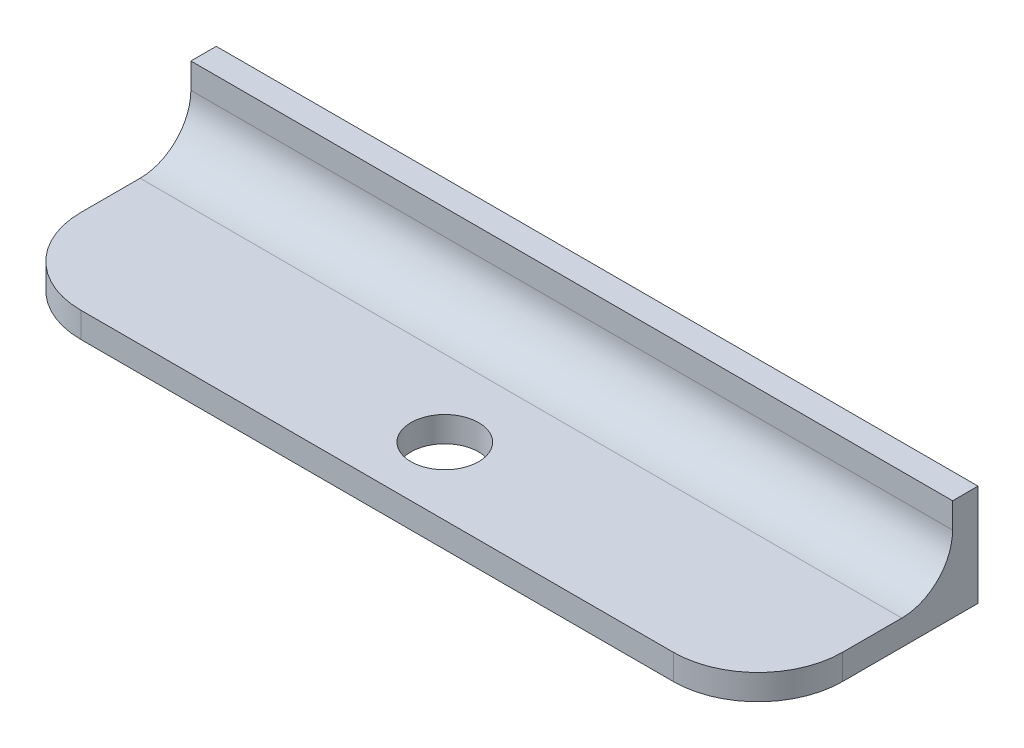
ISO-10303-21;
HEADER;
FILE_DESCRIPTION(('STEP AP214'),'2;1');
FILE_NAME('part.step','',(''),(''),'','','');
FILE_SCHEMA(('AUTOMOTIVE_DESIGN { 1 0 10303 214 1 1 1 1 }'));
ENDSEC;
DATA;
#1=APPLICATION_CONTEXT('core data for automotive mechanical design processes');
#2=APPLICATION_PROTOCOL_DEFINITION('international standard','automotive_design',2000,#1);
#3=PRODUCT_CONTEXT('',#1,'mechanical');
#4=PRODUCT('Part','Part','',(#3));
#5=PRODUCT_RELATED_PRODUCT_CATEGORY('part','',(#4));
#6=PRODUCT_DEFINITION_FORMATION('','',#4);
#7=PRODUCT_DEFINITION_CONTEXT('part definition',#1,'design');
#8=PRODUCT_DEFINITION('design','',#6,#7);
#9=PRODUCT_DEFINITION_SHAPE('','',#8);
#10=(LENGTH_UNIT() NAMED_UNIT(*) SI_UNIT(.MILLI.,.METRE.));
#11=(NAMED_UNIT(*) PLANE_ANGLE_UNIT() SI_UNIT($,.RADIAN.));
#12=(NAMED_UNIT(*) SI_UNIT($,.STERADIAN.) SOLID_ANGLE_UNIT());
#13=UNCERTAINTY_MEASURE_WITH_UNIT(LENGTH_MEASURE(1.E-05),#10,'distance_accuracy_value','');
#14=(GEOMETRIC_REPRESENTATION_CONTEXT(3) GLOBAL_UNCERTAINTY_ASSIGNED_CONTEXT((#13)) GLOBAL_UNIT_ASSIGNED_CONTEXT((#10,
#11,#12)) REPRESENTATION_CONTEXT('',''));
#15=CARTESIAN_POINT('',(0.,0.,0.));
#16=DIRECTION('',(0.,0.,1.));
#17=DIRECTION('',(1.,0.,0.));
#18=AXIS2_PLACEMENT_3D('',#15,#16,#17);
#19=CARTESIAN_POINT('',(-17.5,1.5,-0.999999999999999));
#20=DIRECTION('',(0.,1.,0.));
#21=DIRECTION('',(0.,0.,1.));
#22=AXIS2_PLACEMENT_3D('',#19,#20,#21);
#23=PLANE('',#22);
#24=DIRECTION('',(0.,0.,-1.));
#25=VECTOR('',#24,1.);
#26=CARTESIAN_POINT('',(22.5,1.5,-9.));
#27=LINE('',#26,#25);
#28=CARTESIAN_POINT('',(22.5,1.5,-1.00000000000003));
#29=VERTEX_POINT('',#28);
#30=CARTESIAN_POINT('',(22.5,1.5,-4.5));
#31=VERTEX_POINT('',#30);
#32=EDGE_CURVE('E154',#29,#31,#27,.T.);
#33=ORIENTED_EDGE('',*,*,#32,.T.);
#34=DIRECTION('',(1.,0.,0.));
#35=VECTOR('',#34,1.);
#36=CARTESIAN_POINT('',(-17.5,1.5,-4.5));
#37=LINE('',#36,#35);
#38=CARTESIAN_POINT('',(-22.5,1.5,-4.5));
#39=VERTEX_POINT('',#38);
#40=EDGE_CURVE('E53',#31,#39,#37,.F.);
#41=ORIENTED_EDGE('',*,*,#40,.T.);
#42=DIRECTION('',(0.,0.,1.));
#43=VECTOR('',#42,1.);
#44=CARTESIAN_POINT('',(-22.5,1.5,-9.));
#45=LINE('',#44,#43);
#46=CARTESIAN_POINT('',(-22.5,1.5,-1.00000000000004));
#47=VERTEX_POINT('',#46);
#48=EDGE_CURVE('E141',#39,#47,#45,.T.);
#49=ORIENTED_EDGE('',*,*,#48,.T.);
#50=CARTESIAN_POINT('',(-17.5,1.5,-0.999999999999999));
#51=DIRECTION('',(0.,1.,0.));
#52=DIRECTION('',(0.,0.,1.));
#53=AXIS2_PLACEMENT_3D('',#50,#51,#52);
#54=CIRCLE('',#53,5.);
#55=CARTESIAN_POINT('',(-17.5,1.5,4.));
#56=VERTEX_POINT('',#55);
#57=EDGE_CURVE('E144',#47,#56,#54,.T.);
#58=ORIENTED_EDGE('',*,*,#57,.T.);
#59=DIRECTION('',(1.,0.,0.));
#60=VECTOR('',#59,1.);
#61=CARTESIAN_POINT('',(-17.5,1.5,4.));
#62=LINE('',#61,#60);
#63=CARTESIAN_POINT('',(17.5,1.5,4.));
#64=VERTEX_POINT('',#63);
#65=EDGE_CURVE('E150',#56,#64,#62,.T.);
#66=ORIENTED_EDGE('',*,*,#65,.T.);
#67=CARTESIAN_POINT('',(17.5,1.5,-0.999999999999999));
#68=DIRECTION('',(0.,1.,0.));
#69=DIRECTION('',(0.,0.,1.));
#70=AXIS2_PLACEMENT_3D('',#67,#68,#69);
#71=CIRCLE('',#70,5.);
#72=EDGE_CURVE('E152',#64,#29,#71,.T.);
#73=ORIENTED_EDGE('',*,*,#72,.T.);
#74=EDGE_LOOP('',(#33,#41,#49,#58,#66,#73));
#75=FACE_BOUND('',#74,.T.);
#76=CARTESIAN_POINT('',(0.,1.5,0.));
#77=DIRECTION('',(0.,1.,0.));
#78=DIRECTION('',(0.,0.,1.));
#79=AXIS2_PLACEMENT_3D('',#76,#77,#78);
#80=CIRCLE('',#79,2.);
#81=CARTESIAN_POINT('',(0.,1.5,2.));
#82=VERTEX_POINT('',#81);
#83=EDGE_CURVE('E130',#82,#82,#80,.T.);
#84=ORIENTED_EDGE('',*,*,#83,.F.);
#85=EDGE_LOOP('',(#84));
#86=FACE_BOUND('',#85,.T.);
#87=ADVANCED_FACE('F32',(#75,#86),#23,.T.);
#88=CARTESIAN_POINT('',(-17.5,0.,-0.999999999999999));
#89=DIRECTION('',(0.,1.,0.));
#90=DIRECTION('',(0.,0.,1.));
#91=AXIS2_PLACEMENT_3D('',#88,#89,#90);
#92=PLANE('',#91);
#93=DIRECTION('',(0.,0.,1.));
#94=VECTOR('',#93,1.);
#95=CARTESIAN_POINT('',(-22.5,0.,-9.));
#96=LINE('',#95,#94);
#97=CARTESIAN_POINT('',(-22.5,0.,-9.));
#98=VERTEX_POINT('',#97);
#99=CARTESIAN_POINT('',(-22.5,0.,-1.00000000000004));
#100=VERTEX_POINT('',#99);
#101=EDGE_CURVE('E157',#98,#100,#96,.T.);
#102=ORIENTED_EDGE('',*,*,#101,.F.);
#103=DIRECTION('',(-1.,0.,0.));
#104=VECTOR('',#103,1.);
#105=CARTESIAN_POINT('',(-22.5,0.,-9.));
#106=LINE('',#105,#104);
#107=CARTESIAN_POINT('',(22.5,0.,-9.));
#108=VERTEX_POINT('',#107);
#109=EDGE_CURVE('E145',#108,#98,#106,.T.);
#110=ORIENTED_EDGE('',*,*,#109,.F.);
#111=DIRECTION('',(0.,0.,-1.));
#112=VECTOR('',#111,1.);
#113=CARTESIAN_POINT('',(22.5,0.,-9.));
#114=LINE('',#113,#112);
#115=CARTESIAN_POINT('',(22.5,0.,-1.00000000000003));
#116=VERTEX_POINT('',#115);
#117=EDGE_CURVE('E178',#116,#108,#114,.T.);
#118=ORIENTED_EDGE('',*,*,#117,.F.);
#119=CARTESIAN_POINT('',(17.5,0.,-0.999999999999999));
#120=DIRECTION('',(0.,1.,0.));
#121=DIRECTION('',(0.,0.,1.));
#122=AXIS2_PLACEMENT_3D('',#119,#120,#121);
#123=CIRCLE('',#122,5.);
#124=CARTESIAN_POINT('',(17.5,0.,4.));
#125=VERTEX_POINT('',#124);
#126=EDGE_CURVE('E180',#125,#116,#123,.T.);
#127=ORIENTED_EDGE('',*,*,#126,.F.);
#128=DIRECTION('',(1.,0.,0.));
#129=VECTOR('',#128,1.);
#130=CARTESIAN_POINT('',(-17.5,0.,4.));
#131=LINE('',#130,#129);
#132=CARTESIAN_POINT('',(-17.5,0.,4.));
#133=VERTEX_POINT('',#132);
#134=EDGE_CURVE('E182',#133,#125,#131,.T.);
#135=ORIENTED_EDGE('',*,*,#134,.F.);
#136=CARTESIAN_POINT('',(-17.5,0.,-0.999999999999999));
#137=DIRECTION('',(0.,1.,0.));
#138=DIRECTION('',(0.,0.,1.));
#139=AXIS2_PLACEMENT_3D('',#136,#137,#138);
#140=CIRCLE('',#139,5.);
#141=EDGE_CURVE('E183',#100,#133,#140,.T.);
#142=ORIENTED_EDGE('',*,*,#141,.F.);
#143=EDGE_LOOP('',(#102,#110,#118,#127,#135,#142));
#144=FACE_BOUND('',#143,.T.);
#145=CARTESIAN_POINT('',(0.,0.,0.));
#146=DIRECTION('',(0.,1.,0.));
#147=DIRECTION('',(0.,0.,1.));
#148=AXIS2_PLACEMENT_3D('',#145,#146,#147);
#149=CIRCLE('',#148,2.);
#150=CARTESIAN_POINT('',(0.,0.,2.));
#151=VERTEX_POINT('',#150);
#152=EDGE_CURVE('E127',#151,#151,#149,.T.);
#153=ORIENTED_EDGE('',*,*,#152,.T.);
#154=EDGE_LOOP('',(#153));
#155=FACE_BOUND('',#154,.T.);
#156=ADVANCED_FACE('F197',(#144,#155),#92,.F.);
#157=CARTESIAN_POINT('',(-22.5,1.5,-9.));
#158=DIRECTION('',(1.,0.,0.));
#159=DIRECTION('',(0.,0.,-1.));
#160=AXIS2_PLACEMENT_3D('',#157,#158,#159);
#161=PLANE('',#160);
#162=ORIENTED_EDGE('',*,*,#101,.T.);
#163=DIRECTION('',(0.,-1.,0.));
#164=VECTOR('',#163,1.);
#165=CARTESIAN_POINT('',(-22.5,1.5,-1.00000000000004));
#166=LINE('',#165,#164);
#167=EDGE_CURVE('E140',#47,#100,#166,.T.);
#168=ORIENTED_EDGE('',*,*,#167,.F.);
#169=ORIENTED_EDGE('',*,*,#48,.F.);
#170=CARTESIAN_POINT('',(-22.5,4.5,-4.5));
#171=DIRECTION('',(1.,0.,0.));
#172=DIRECTION('',(0.,0.,-1.));
#173=AXIS2_PLACEMENT_3D('',#170,#171,#172);
#174=CIRCLE('',#173,3.);
#175=CARTESIAN_POINT('',(-22.5,4.5,-7.5));
#176=VERTEX_POINT('',#175);
#177=EDGE_CURVE('E11',#39,#176,#174,.T.);
#178=ORIENTED_EDGE('',*,*,#177,.T.);
#179=DIRECTION('',(0.,-1.,0.));
#180=VECTOR('',#179,1.);
#181=CARTESIAN_POINT('',(-22.5,6.,-7.5));
#182=LINE('',#181,#180);
#183=CARTESIAN_POINT('',(-22.5,6.,-7.5));
#184=VERTEX_POINT('',#183);
#185=EDGE_CURVE('E107',#184,#176,#182,.T.);
#186=ORIENTED_EDGE('',*,*,#185,.F.);
#187=DIRECTION('',(0.,0.,1.));
#188=VECTOR('',#187,1.);
#189=CARTESIAN_POINT('',(-22.5,6.,-9.));
#190=LINE('',#189,#188);
#191=CARTESIAN_POINT('',(-22.5,6.,-9.));
#192=VERTEX_POINT('',#191);
#193=EDGE_CURVE('E114',#192,#184,#190,.T.);
#194=ORIENTED_EDGE('',*,*,#193,.F.);
#195=DIRECTION('',(0.,-1.,0.));
#196=VECTOR('',#195,1.);
#197=CARTESIAN_POINT('',(-22.5,1.5,-9.));
#198=LINE('',#197,#196);
#199=EDGE_CURVE('E161',#192,#98,#198,.T.);
#200=ORIENTED_EDGE('',*,*,#199,.T.);
#201=EDGE_LOOP('',(#162,#168,#169,#178,#186,#194,#200));
#202=FACE_BOUND('',#201,.T.);
#203=ADVANCED_FACE('F125',(#202),#161,.F.);
#204=CARTESIAN_POINT('',(-17.5,1.5,-0.999999999999999));
#205=DIRECTION('',(0.,-1.,0.));
#206=DIRECTION('',(0.,0.,-1.));
#207=AXIS2_PLACEMENT_3D('',#204,#205,#206);
#208=CYLINDRICAL_SURFACE('',#207,5.);
#209=ORIENTED_EDGE('',*,*,#141,.T.);
#210=DIRECTION('',(0.,-1.,0.));
#211=VECTOR('',#210,1.);
#212=CARTESIAN_POINT('',(-17.5,1.5,4.));
#213=LINE('',#212,#211);
#214=EDGE_CURVE('E164',#56,#133,#213,.T.);
#215=ORIENTED_EDGE('',*,*,#214,.F.);
#216=ORIENTED_EDGE('',*,*,#57,.F.);
#217=ORIENTED_EDGE('',*,*,#167,.T.);
#218=EDGE_LOOP('',(#209,#215,#216,#217));
#219=FACE_BOUND('',#218,.T.);
#220=ADVANCED_FACE('F203',(#219),#208,.T.);
#221=CARTESIAN_POINT('',(-17.5,1.5,4.));
#222=DIRECTION('',(0.,0.,-1.));
#223=DIRECTION('',(-1.,0.,0.));
#224=AXIS2_PLACEMENT_3D('',#221,#222,#223);
#225=PLANE('',#224);
#226=ORIENTED_EDGE('',*,*,#134,.T.);
#227=DIRECTION('',(0.,-1.,0.));
#228=VECTOR('',#227,1.);
#229=CARTESIAN_POINT('',(17.5,1.5,4.));
#230=LINE('',#229,#228);
#231=EDGE_CURVE('E167',#64,#125,#230,.T.);
#232=ORIENTED_EDGE('',*,*,#231,.F.);
#233=ORIENTED_EDGE('',*,*,#65,.F.);
#234=ORIENTED_EDGE('',*,*,#214,.T.);
#235=EDGE_LOOP('',(#226,#232,#233,#234));
#236=FACE_BOUND('',#235,.T.);
#237=ADVANCED_FACE('F215',(#236),#225,.F.);
#238=CARTESIAN_POINT('',(17.5,1.5,-0.999999999999999));
#239=DIRECTION('',(0.,-1.,0.));
#240=DIRECTION('',(0.,0.,-1.));
#241=AXIS2_PLACEMENT_3D('',#238,#239,#240);
#242=CYLINDRICAL_SURFACE('',#241,5.);
#243=ORIENTED_EDGE('',*,*,#126,.T.);
#244=DIRECTION('',(0.,-1.,0.));
#245=VECTOR('',#244,1.);
#246=CARTESIAN_POINT('',(22.5,1.5,-1.00000000000003));
#247=LINE('',#246,#245);
#248=EDGE_CURVE('E170',#29,#116,#247,.T.);
#249=ORIENTED_EDGE('',*,*,#248,.F.);
#250=ORIENTED_EDGE('',*,*,#72,.F.);
#251=ORIENTED_EDGE('',*,*,#231,.T.);
#252=EDGE_LOOP('',(#243,#249,#250,#251));
#253=FACE_BOUND('',#252,.T.);
#254=ADVANCED_FACE('F207',(#253),#242,.T.);
#255=CARTESIAN_POINT('',(22.5,1.5,-9.));
#256=DIRECTION('',(-1.,0.,0.));
#257=DIRECTION('',(0.,0.,1.));
#258=AXIS2_PLACEMENT_3D('',#255,#256,#257);
#259=PLANE('',#258);
#260=ORIENTED_EDGE('',*,*,#117,.T.);
#261=DIRECTION('',(0.,-1.,0.));
#262=VECTOR('',#261,1.);
#263=CARTESIAN_POINT('',(22.5,1.5,-9.));
#264=LINE('',#263,#262);
#265=CARTESIAN_POINT('',(22.5,6.,-9.));
#266=VERTEX_POINT('',#265);
#267=EDGE_CURVE('E173',#266,#108,#264,.T.);
#268=ORIENTED_EDGE('',*,*,#267,.F.);
#269=DIRECTION('',(0.,0.,-1.));
#270=VECTOR('',#269,1.);
#271=CARTESIAN_POINT('',(22.5,6.,-9.));
#272=LINE('',#271,#270);
#273=CARTESIAN_POINT('',(22.5,6.,-7.5));
#274=VERTEX_POINT('',#273);
#275=EDGE_CURVE('E113',#274,#266,#272,.T.);
#276=ORIENTED_EDGE('',*,*,#275,.F.);
#277=DIRECTION('',(0.,-1.,0.));
#278=VECTOR('',#277,1.);
#279=CARTESIAN_POINT('',(22.5,6.,-7.5));
#280=LINE('',#279,#278);
#281=CARTESIAN_POINT('',(22.5,4.5,-7.5));
#282=VERTEX_POINT('',#281);
#283=EDGE_CURVE('E109',#274,#282,#280,.T.);
#284=ORIENTED_EDGE('',*,*,#283,.T.);
#285=CARTESIAN_POINT('',(22.5,4.5,-4.5));
#286=DIRECTION('',(-1.,0.,0.));
#287=DIRECTION('',(0.,0.,1.));
#288=AXIS2_PLACEMENT_3D('',#285,#286,#287);
#289=CIRCLE('',#288,3.);
#290=EDGE_CURVE('E40',#282,#31,#289,.T.);
#291=ORIENTED_EDGE('',*,*,#290,.T.);
#292=ORIENTED_EDGE('',*,*,#32,.F.);
#293=ORIENTED_EDGE('',*,*,#248,.T.);
#294=EDGE_LOOP('',(#260,#268,#276,#284,#291,#292,#293));
#295=FACE_BOUND('',#294,.T.);
#296=ADVANCED_FACE('F205',(#295),#259,.F.);
#297=CARTESIAN_POINT('',(-22.5,1.5,-9.));
#298=DIRECTION('',(0.,0.,1.));
#299=DIRECTION('',(1.,0.,0.));
#300=AXIS2_PLACEMENT_3D('',#297,#298,#299);
#301=PLANE('',#300);
#302=ORIENTED_EDGE('',*,*,#109,.T.);
#303=ORIENTED_EDGE('',*,*,#199,.F.);
#304=DIRECTION('',(-1.,0.,0.));
#305=VECTOR('',#304,1.);
#306=CARTESIAN_POINT('',(-22.5,6.,-9.));
#307=LINE('',#306,#305);
#308=EDGE_CURVE('E120',#266,#192,#307,.T.);
#309=ORIENTED_EDGE('',*,*,#308,.F.);
#310=ORIENTED_EDGE('',*,*,#267,.T.);
#311=EDGE_LOOP('',(#302,#303,#309,#310));
#312=FACE_BOUND('',#311,.T.);
#313=ADVANCED_FACE('F194',(#312),#301,.F.);
#314=CARTESIAN_POINT('',(0.,1.5,0.));
#315=DIRECTION('',(0.,-1.,0.));
#316=DIRECTION('',(0.,0.,-1.));
#317=AXIS2_PLACEMENT_3D('',#314,#315,#316);
#318=CYLINDRICAL_SURFACE('',#317,2.);
#319=ORIENTED_EDGE('',*,*,#83,.T.);
#320=EDGE_LOOP('',(#319));
#321=FACE_BOUND('',#320,.T.);
#322=ORIENTED_EDGE('',*,*,#152,.F.);
#323=EDGE_LOOP('',(#322));
#324=FACE_BOUND('',#323,.T.);
#325=ADVANCED_FACE('F213',(#321,#324),#318,.F.);
#326=CARTESIAN_POINT('',(-22.5,6.,-7.5));
#327=DIRECTION('',(0.,0.,-1.));
#328=DIRECTION('',(-1.,0.,0.));
#329=AXIS2_PLACEMENT_3D('',#326,#327,#328);
#330=PLANE('',#329);
#331=ORIENTED_EDGE('',*,*,#185,.T.);
#332=DIRECTION('',(1.,0.,0.));
#333=VECTOR('',#332,1.);
#334=CARTESIAN_POINT('',(-22.5,4.5,-7.5));
#335=LINE('',#334,#333);
#336=EDGE_CURVE('E138',#176,#282,#335,.T.);
#337=ORIENTED_EDGE('',*,*,#336,.T.);
#338=ORIENTED_EDGE('',*,*,#283,.F.);
#339=DIRECTION('',(1.,0.,0.));
#340=VECTOR('',#339,1.);
#341=CARTESIAN_POINT('',(-22.5,6.,-7.5));
#342=LINE('',#341,#340);
#343=EDGE_CURVE('E102',#184,#274,#342,.T.);
#344=ORIENTED_EDGE('',*,*,#343,.F.);
#345=EDGE_LOOP('',(#331,#337,#338,#344));
#346=FACE_BOUND('',#345,.T.);
#347=ADVANCED_FACE('F104',(#346),#330,.F.);
#348=CARTESIAN_POINT('',(0.,6.,0.));
#349=DIRECTION('',(0.,1.,0.));
#350=DIRECTION('',(0.,0.,1.));
#351=AXIS2_PLACEMENT_3D('',#348,#349,#350);
#352=PLANE('',#351);
#353=ORIENTED_EDGE('',*,*,#193,.T.);
#354=ORIENTED_EDGE('',*,*,#343,.T.);
#355=ORIENTED_EDGE('',*,*,#275,.T.);
#356=ORIENTED_EDGE('',*,*,#308,.T.);
#357=EDGE_LOOP('',(#353,#354,#355,#356));
#358=FACE_BOUND('',#357,.T.);
#359=ADVANCED_FACE('F118',(#358),#352,.T.);
#360=CARTESIAN_POINT('',(-22.5,4.5,-4.5));
#361=DIRECTION('',(1.,0.,0.));
#362=DIRECTION('',(0.,0.,-1.));
#363=AXIS2_PLACEMENT_3D('',#360,#361,#362);
#364=CYLINDRICAL_SURFACE('',#363,3.);
#365=ORIENTED_EDGE('',*,*,#177,.F.);
#366=ORIENTED_EDGE('',*,*,#40,.F.);
#367=ORIENTED_EDGE('',*,*,#290,.F.);
#368=ORIENTED_EDGE('',*,*,#336,.F.);
#369=EDGE_LOOP('',(#365,#366,#367,#368));
#370=FACE_BOUND('',#369,.T.);
#371=ADVANCED_FACE('F34',(#370),#364,.F.);
#372=CLOSED_SHELL('',(#87,#156,#203,#220,#237,#254,#296,#313,#325,#347,#359,#371));
#373=MANIFOLD_SOLID_BREP('B2',#372);
#374=ADVANCED_BREP_SHAPE_REPRESENTATION('',(#18,#373),#14);
#375=SHAPE_DEFINITION_REPRESENTATION(#9,#374);
ENDSEC;
END-ISO-10303-21;
